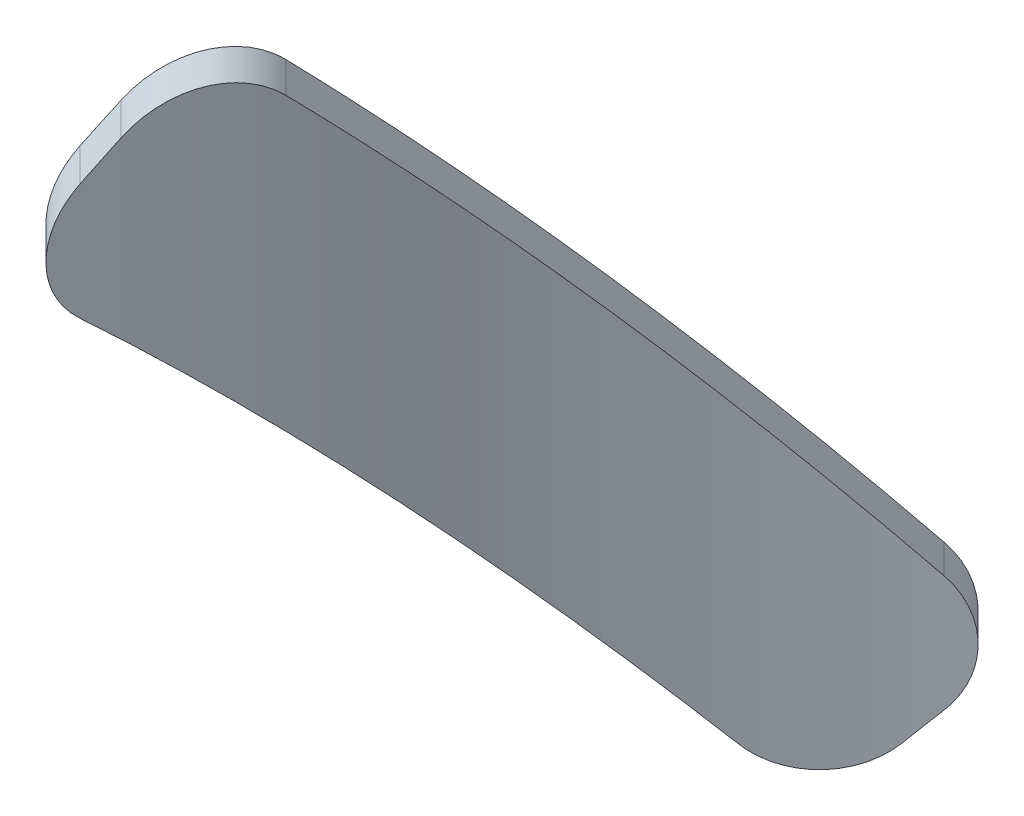
ISO-10303-21;
HEADER;
FILE_DESCRIPTION(('STEP AP214'),'2;1');
FILE_NAME('part.step','',(''),(''),'','','');
FILE_SCHEMA(('AUTOMOTIVE_DESIGN { 1 0 10303 214 1 1 1 1 }'));
ENDSEC;
DATA;
#1=APPLICATION_CONTEXT('core data for automotive mechanical design processes');
#2=APPLICATION_PROTOCOL_DEFINITION('international standard','automotive_design',2000,#1);
#3=PRODUCT_CONTEXT('',#1,'mechanical');
#4=PRODUCT('Part','Part','',(#3));
#5=PRODUCT_RELATED_PRODUCT_CATEGORY('part','',(#4));
#6=PRODUCT_DEFINITION_FORMATION('','',#4);
#7=PRODUCT_DEFINITION_CONTEXT('part definition',#1,'design');
#8=PRODUCT_DEFINITION('design','',#6,#7);
#9=PRODUCT_DEFINITION_SHAPE('','',#8);
#10=(LENGTH_UNIT() NAMED_UNIT(*) SI_UNIT(.MILLI.,.METRE.));
#11=(NAMED_UNIT(*) PLANE_ANGLE_UNIT() SI_UNIT($,.RADIAN.));
#12=(NAMED_UNIT(*) SI_UNIT($,.STERADIAN.) SOLID_ANGLE_UNIT());
#13=UNCERTAINTY_MEASURE_WITH_UNIT(LENGTH_MEASURE(1.E-05),#10,'distance_accuracy_value','');
#14=(GEOMETRIC_REPRESENTATION_CONTEXT(3) GLOBAL_UNCERTAINTY_ASSIGNED_CONTEXT((#13)) GLOBAL_UNIT_ASSIGNED_CONTEXT((#10,
#11,#12)) REPRESENTATION_CONTEXT('',''));
#15=CARTESIAN_POINT('',(0.,0.,0.));
#16=DIRECTION('',(0.,0.,1.));
#17=DIRECTION('',(1.,0.,0.));
#18=AXIS2_PLACEMENT_3D('',#15,#16,#17);
#19=CARTESIAN_POINT('',(-30.,0.,-30.));
#20=DIRECTION('',(0.,1.,0.));
#21=DIRECTION('',(0.,0.,1.));
#22=AXIS2_PLACEMENT_3D('',#19,#20,#21);
#23=CYLINDRICAL_SURFACE('',#22,28.);
#24=CARTESIAN_POINT('',(-30.,157.851563231927,-30.));
#25=DIRECTION('',(0.500000000000006,0.707106781186537,-0.50000000000001));
#26=DIRECTION('',(-0.49999999999999,0.707106781186558,0.499999999999994));
#27=AXIS2_PLACEMENT_3D('',#24,#25,#26);
#28=ELLIPSE('',#27,39.5979797464473,28.);
#29=CARTESIAN_POINT('',(-55.3750410390185,167.42462120246,-41.8366926237073));
#30=VERTEX_POINT('',#29);
#31=CARTESIAN_POINT('',(-48.5298692326011,156.110912703475,-50.9915208172896));
#32=VERTEX_POINT('',#31);
#33=EDGE_CURVE('E198',#30,#32,#28,.F.);
#34=ORIENTED_EDGE('',*,*,#33,.T.);
#35=CARTESIAN_POINT('',(-48.5298692326011,156.110912703475,-50.9915208172896));
#36=CARTESIAN_POINT('',(-48.5000069207955,156.071156552495,-51.0178811881751));
#37=CARTESIAN_POINT('',(-48.4713576898488,156.029742015388,-51.0430574230909));
#38=CARTESIAN_POINT('',(-48.4166869497929,155.943856067044,-51.0909212956081));
#39=CARTESIAN_POINT('',(-48.3906653495738,155.899384761887,-51.1136090194978));
#40=CARTESIAN_POINT('',(-48.3169162246269,155.761910814532,-51.1776964857547));
#41=CARTESIAN_POINT('',(-48.2734122760362,155.664725548558,-51.2152014707099));
#42=CARTESIAN_POINT('',(-48.1992472592149,155.462080861051,-51.278858189969));
#43=CARTESIAN_POINT('',(-48.1685932846773,155.356616907393,-51.3050036536582));
#44=CARTESIAN_POINT('',(-48.1211794442531,155.140421993944,-51.3453468171134));
#45=CARTESIAN_POINT('',(-48.1044163952034,155.029692246984,-51.3595472541429));
#46=CARTESIAN_POINT('',(-48.0853841738306,154.806368489452,-51.3756646296976));
#47=CARTESIAN_POINT('',(-48.083082687666,154.693779199245,-51.377608954096));
#48=CARTESIAN_POINT('',(-48.0929673425292,154.469672441037,-51.3692436109049));
#49=CARTESIAN_POINT('',(-48.1051562295487,154.358155180229,-51.3589316206881));
#50=CARTESIAN_POINT('',(-48.143575601618,154.139529439369,-51.3263051790284));
#51=CARTESIAN_POINT('',(-48.1697892620648,154.032415841982,-51.3040051087474));
#52=CARTESIAN_POINT('',(-48.2353576084328,153.825496036109,-51.2479076750144));
#53=CARTESIAN_POINT('',(-48.2747052320573,153.725685935532,-51.2141164902955));
#54=CARTESIAN_POINT('',(-48.3500473081551,153.567877341369,-51.1489323789086));
#55=CARTESIAN_POINT('',(-48.3827745622405,153.507045687126,-51.1205060147201));
#56=CARTESIAN_POINT('',(-48.4529191400616,153.390665908989,-51.0592482480549));
#57=CARTESIAN_POINT('',(-48.4903296272965,153.335110287003,-51.0264232617869));
#58=CARTESIAN_POINT('',(-48.5298692326011,153.282485578729,-50.9915208172896));
#59=B_SPLINE_CURVE_WITH_KNOTS('',3,(#35,#36,#37,#38,#39,#40,#41,#42,#43,#44,#45,#46,#47,#48,#49,
#50,#51,#52,#53,#54,#55,#56,#57,#58),.UNSPECIFIED.,.F.,.F.,(4,2,2,2,2,2,2,2,2,2,2,4),(0.,
0.168729734635028,0.337453616765153,0.674387818960096,1.01150777796911,1.34855046316446,
1.68483977001452,2.02119281537659,2.35714326178451,2.69291335365137,2.91657000574833,
3.13990389399824),.UNSPECIFIED.);
#60=CARTESIAN_POINT('',(-48.5298692326011,153.282485578729,-50.9915208172895));
#61=VERTEX_POINT('',#60);
#62=EDGE_CURVE('E277',#32,#61,#59,.T.);
#63=ORIENTED_EDGE('',*,*,#62,.T.);
#64=CARTESIAN_POINT('',(-30.,151.541835050277,-30.));
#65=DIRECTION('',(0.49999999999999,-0.707106781186559,-0.499999999999994));
#66=DIRECTION('',(0.500000000000006,0.707106781186536,-0.50000000000001));
#67=AXIS2_PLACEMENT_3D('',#64,#65,#66);
#68=ELLIPSE('',#67,39.597979746446,28.);
#69=CARTESIAN_POINT('',(-49.0546712613375,152.575378797542,-50.5163228460258));
#70=VERTEX_POINT('',#69);
#71=EDGE_CURVE('E335',#61,#70,#68,.F.);
#72=ORIENTED_EDGE('',*,*,#71,.T.);
#73=CARTESIAN_POINT('',(-49.0546712613375,152.575378797542,-50.5163228460258));
#74=CARTESIAN_POINT('',(-49.0838184947001,152.535627348901,-50.489252153609));
#75=CARTESIAN_POINT('',(-49.1141213045857,152.497570929926,-50.4609923628528));
#76=CARTESIAN_POINT('',(-49.1768172658032,152.425076219856,-50.4022432334779));
#77=CARTESIAN_POINT('',(-49.2092103361668,152.39063778875,-50.3717539812137));
#78=CARTESIAN_POINT('',(-49.3090924847616,152.293189360768,-50.2772608370442));
#79=CARTESIAN_POINT('',(-49.3793775323393,152.235919841276,-50.2101455069575));
#80=CARTESIAN_POINT('',(-49.5250984200888,152.138487230076,-50.0693995608617));
#81=CARTESIAN_POINT('',(-49.6005369779055,152.098333246118,-49.9957655011235));
#82=CARTESIAN_POINT('',(-49.7542513779122,152.036282536247,-49.8439211630516));
#83=CARTESIAN_POINT('',(-49.8325266114309,152.014381917594,-49.7657118642499));
#84=CARTESIAN_POINT('',(-49.9894820237552,151.98947803605,-49.606964299381));
#85=CARTESIAN_POINT('',(-50.0681614589192,151.986447659908,-49.5264295419427));
#86=CARTESIAN_POINT('',(-50.2238083149542,151.99928986518,-49.3651784441199));
#87=CARTESIAN_POINT('',(-50.3007753945302,152.015166181167,-49.284462071005));
#88=CARTESIAN_POINT('',(-50.4508580459992,152.065355059361,-49.1252290489235));
#89=CARTESIAN_POINT('',(-50.5239736883487,152.099667284182,-49.0467123597291));
#90=CARTESIAN_POINT('',(-50.664421412323,152.185747265915,-48.8942432037143));
#91=CARTESIAN_POINT('',(-50.7317566286914,152.237505485814,-48.8202882692436));
#92=CARTESIAN_POINT('',(-50.8376280916141,152.336927261314,-48.7028678295944));
#93=CARTESIAN_POINT('',(-50.8782612258911,152.380165084059,-48.6574810328362));
#94=CARTESIAN_POINT('',(-50.9557553688766,152.473075335721,-48.5703990523208));
#95=CARTESIAN_POINT('',(-50.9926216929122,152.522738467059,-48.5286986782002));
#96=CARTESIAN_POINT('',(-51.027443282416,152.575378797542,-48.4890948671042));
#97=B_SPLINE_CURVE_WITH_KNOTS('',3,(#73,#74,#75,#76,#77,#78,#79,#80,#81,#82,#83,#84,#85,#86,#87,
#88,#89,#90,#91,#92,#93,#94,#95,#96),.UNSPECIFIED.,.F.,.F.,(4,2,2,2,2,2,2,2,2,2,2,4),(0.,
0.168606603227999,0.337206679217326,0.673876716753877,1.01072568471362,1.34750279735457,
1.68379590810657,2.02015545666998,2.35650884989252,2.69267866986512,2.91635391483469,
3.13970904243861),.UNSPECIFIED.);
#98=CARTESIAN_POINT('',(-51.027443282416,152.575378797542,-48.4890948671041));
#99=VERTEX_POINT('',#98);
#100=EDGE_CURVE('E305',#70,#99,#97,.T.);
#101=ORIENTED_EDGE('',*,*,#100,.T.);
#102=CARTESIAN_POINT('',(-30.,150.780495420061,-30.));
#103=DIRECTION('',(-0.500000000000015,-0.707106781186523,0.500000000000019));
#104=DIRECTION('',(-0.499999999999981,0.707106781186572,0.499999999999985));
#105=AXIS2_PLACEMENT_3D('',#102,#103,#104);
#106=ELLIPSE('',#105,39.597979746448,28.);
#107=CARTESIAN_POINT('',(-56.7643852526283,163.889087296527,-38.2260368373169));
#108=VERTEX_POINT('',#107);
#109=EDGE_CURVE('E304',#99,#108,#106,.F.);
#110=ORIENTED_EDGE('',*,*,#109,.T.);
#111=CARTESIAN_POINT('',(-56.7643852526283,163.889087296527,-38.2260368373169));
#112=CARTESIAN_POINT('',(-56.776641215634,163.925953268659,-38.1861615850808));
#113=CARTESIAN_POINT('',(-56.788390596239,163.964399178829,-38.1476151035475));
#114=CARTESIAN_POINT('',(-56.8108306041014,164.044358269233,-38.0734664484447));
#115=CARTESIAN_POINT('',(-56.8215206492122,164.085873114328,-38.0378658955319));
#116=CARTESIAN_POINT('',(-56.851976938465,164.215085817851,-37.935766268294));
#117=CARTESIAN_POINT('',(-56.8700524958863,164.307221361908,-37.8742209469578));
#118=CARTESIAN_POINT('',(-56.9012216878482,164.501558608482,-37.7670728894173));
#119=CARTESIAN_POINT('',(-56.9142975214104,164.603794677194,-37.7215271639633));
#120=CARTESIAN_POINT('',(-56.9349232764219,164.815088065883,-37.6492704529723));
#121=CARTESIAN_POINT('',(-56.9424847853383,164.924130556403,-37.6225199765903));
#122=CARTESIAN_POINT('',(-56.9514581277469,165.136872699362,-37.5907281762104));
#123=CARTESIAN_POINT('',(-56.953303069718,165.240326996355,-37.5841582710898));
#124=CARTESIAN_POINT('',(-56.9520105108362,165.446804135519,-37.5887507396826));
#125=CARTESIAN_POINT('',(-56.9488737500457,165.549827039497,-37.5999104795487));
#126=CARTESIAN_POINT('',(-56.937998704469,165.74740963295,-37.6383630322157));
#127=CARTESIAN_POINT('',(-56.9304869211357,165.842138646437,-37.6648613559587));
#128=CARTESIAN_POINT('',(-56.9112683830522,166.026044069808,-37.7320664508494));
#129=CARTESIAN_POINT('',(-56.8995562695208,166.115213215039,-37.7727913705591));
#130=CARTESIAN_POINT('',(-56.8703313331978,166.297880085867,-37.8732697288594));
#131=CARTESIAN_POINT('',(-56.8522405965173,166.390273367769,-37.9348749371042));
#132=CARTESIAN_POINT('',(-56.8217283281516,166.519908514088,-38.0371733516411));
#133=CARTESIAN_POINT('',(-56.8110019794864,166.561606463275,-38.0728979919169));
#134=CARTESIAN_POINT('',(-56.788481970071,166.641902913396,-38.1473153340714));
#135=CARTESIAN_POINT('',(-56.7766890274501,166.680503467219,-38.1860060362886));
#136=CARTESIAN_POINT('',(-56.7643852526282,166.717514421273,-38.226036837317));
#137=B_SPLINE_CURVE_WITH_KNOTS('',3,(#111,#112,#113,#114,#115,#116,#117,#118,#119,#120,#121,
#122,#123,#124,#125,#126,#127,#128,#129,#130,#131,#132,#133,#134,#135,#136),.UNSPECIFIED.,.F.,
.F.,(4,2,2,2,2,2,2,2,2,2,2,2,4),(0.,0.16693473233809,0.333960698987016,0.669050148588139,
1.00532177880261,1.34088473595609,1.65031171917411,1.95969273941767,2.25432438345938,
2.5493332636037,2.88510642600991,3.05280120639973,3.22038390801111),.UNSPECIFIED.);
#138=CARTESIAN_POINT('',(-56.7643852526282,166.717514421273,-38.226036837317));
#139=VERTEX_POINT('',#138);
#140=EDGE_CURVE('E301',#108,#139,#137,.T.);
#141=ORIENTED_EDGE('',*,*,#140,.T.);
#142=CARTESIAN_POINT('',(-30.,179.826106297738,-30.));
#143=DIRECTION('',(-0.499999999999988,0.707106781186562,0.499999999999992));
#144=DIRECTION('',(0.500000000000009,0.707106781186533,-0.500000000000012));
#145=AXIS2_PLACEMENT_3D('',#142,#143,#144);
#146=ELLIPSE('',#145,39.5979797464458,28.);
#147=CARTESIAN_POINT('',(-56.5202751232548,167.42462120246,-38.9819267079437));
#148=VERTEX_POINT('',#147);
#149=EDGE_CURVE('E211',#139,#148,#146,.F.);
#150=ORIENTED_EDGE('',*,*,#149,.T.);
#151=CARTESIAN_POINT('',(-56.5202751232548,167.42462120246,-38.9819267079437));
#152=CARTESIAN_POINT('',(-56.4895196309032,167.510669527077,-39.0728050858537));
#153=CARTESIAN_POINT('',(-56.455828480866,167.587977499844,-39.1706835560118));
#154=CARTESIAN_POINT('',(-56.3834880922561,167.723921400822,-39.3767320471662));
#155=CARTESIAN_POINT('',(-56.3448488852947,167.78259429419,-39.4848811340951));
#156=CARTESIAN_POINT('',(-56.263449485485,167.880364450654,-39.7080066716459));
#157=CARTESIAN_POINT('',(-56.2206947613322,167.919487275055,-39.8229739862667));
#158=CARTESIAN_POINT('',(-56.1319266573786,167.977575941348,-40.0567400601932));
#159=CARTESIAN_POINT('',(-56.0859117846212,167.996532483794,-40.1755405611334));
#160=CARTESIAN_POINT('',(-55.9898647052689,168.014017526186,-40.4184762288237));
#161=CARTESIAN_POINT('',(-55.9397457395959,168.011716763197,-40.5426380780232));
#162=CARTESIAN_POINT('',(-55.8386108233751,167.984285241973,-40.7881329261961));
#163=CARTESIAN_POINT('',(-55.7875945850669,167.959147023711,-40.9094649875137));
#164=CARTESIAN_POINT('',(-55.6874427244509,167.886794592816,-41.1432114770296));
#165=CARTESIAN_POINT('',(-55.6382898008684,167.840013484587,-41.2557523919334));
#166=CARTESIAN_POINT('',(-55.542882644111,167.725213292254,-41.4706108761247));
#167=CARTESIAN_POINT('',(-55.4966218577129,167.657244478292,-41.5729518950946));
#168=CARTESIAN_POINT('',(-55.4394094092697,167.55554620755,-41.6977569438735));
#169=CARTESIAN_POINT('',(-55.4261424709155,167.530600080744,-41.726561517957));
#170=CARTESIAN_POINT('',(-55.4001661463789,167.478933818415,-41.7827207418522));
#171=CARTESIAN_POINT('',(-55.3874560556898,167.452216038681,-41.8100772334325));
#172=CARTESIAN_POINT('',(-55.3750410390185,167.42462120246,-41.8366926237074));
#173=B_SPLINE_CURVE_WITH_KNOTS('',3,(#151,#152,#153,#154,#155,#156,#157,#158,#159,#160,#161,
#162,#163,#164,#165,#166,#167,#168,#169,#170,#171,#172),.UNSPECIFIED.,.F.,.F.,(4,2,2,2,2,2,2,2,
2,2,4),(0.,0.385838680752368,0.770907148672841,1.15547082166198,1.54021175492939,
1.9400231959306,2.33996528531806,2.73222886218637,3.12356874500616,3.24456549783948,
3.36540446675177),.UNSPECIFIED.);
#174=EDGE_CURVE('E204',#148,#30,#173,.T.);
#175=ORIENTED_EDGE('',*,*,#174,.T.);
#176=EDGE_LOOP('',(#34,#63,#72,#101,#110,#141,#150,#175));
#177=FACE_BOUND('',#176,.T.);
#178=ADVANCED_FACE('F116',(#177),#23,.T.);
#179=CARTESIAN_POINT('',(61.3719205041654,156.110912703475,58.910268919476));
#180=DIRECTION('',(0.500000000000006,0.707106781186537,-0.50000000000001));
#181=DIRECTION('',(0.,0.577350269189639,0.816496580927717));
#182=AXIS2_PLACEMENT_3D('',#179,#180,#181);
#183=PLANE('',#182);
#184=DIRECTION('',(-0.70710678118655,0.,-0.707106781186545));
#185=VECTOR('',#184,1.);
#186=CARTESIAN_POINT('',(53.3719205041655,167.42462120246,66.9102689194759));
#187=LINE('',#186,#185);
#188=CARTESIAN_POINT('',(-54.6207366195682,167.42462120246,-41.082388204257));
#189=VERTEX_POINT('',#188);
#190=EDGE_CURVE('E183',#189,#30,#187,.T.);
#191=ORIENTED_EDGE('',*,*,#190,.F.);
#192=CARTESIAN_POINT('',(-30.,157.851563231927,-30.));
#193=DIRECTION('',(0.500000000000006,0.707106781186537,-0.500000000000009));
#194=DIRECTION('',(0.499999999999991,-0.707106781186558,-0.499999999999994));
#195=AXIS2_PLACEMENT_3D('',#192,#193,#194);
#196=ELLIPSE('',#195,38.1837661840741,27.);
#197=CARTESIAN_POINT('',(-47.8213412200693,156.110912703475,-50.2829928047579));
#198=VERTEX_POINT('',#197);
#199=EDGE_CURVE('E195',#189,#198,#196,.F.);
#200=ORIENTED_EDGE('',*,*,#199,.T.);
#201=DIRECTION('',(-0.70710678118655,0.,-0.707106781186545));
#202=VECTOR('',#201,1.);
#203=CARTESIAN_POINT('',(61.3719205041654,156.110912703475,58.910268919476));
#204=LINE('',#203,#202);
#205=EDGE_CURVE('E135',#198,#32,#204,.T.);
#206=ORIENTED_EDGE('',*,*,#205,.T.);
#207=ORIENTED_EDGE('',*,*,#33,.F.);
#208=EDGE_LOOP('',(#191,#200,#206,#207));
#209=FACE_BOUND('',#208,.T.);
#210=ADVANCED_FACE('F194',(#209),#183,.T.);
#211=CARTESIAN_POINT('',(52.3719205041655,166.010407640087,67.9102689194759));
#212=DIRECTION('',(-0.70710678118655,0.,-0.707106781186545));
#213=DIRECTION('',(-0.707106781186545,0.,0.70710678118655));
#214=AXIS2_PLACEMENT_3D('',#211,#212,#213);
#215=CYLINDRICAL_SURFACE('',#214,2.);
#216=DIRECTION('',(-0.70710678118655,0.,-0.707106781186545));
#217=VECTOR('',#216,1.);
#218=CARTESIAN_POINT('',(51.3719205041656,167.42462120246,68.9102689194759));
#219=LINE('',#218,#217);
#220=CARTESIAN_POINT('',(-55.7279944412623,167.42462120246,-38.1896460259512));
#221=VERTEX_POINT('',#220);
#222=EDGE_CURVE('E186',#221,#148,#219,.T.);
#223=ORIENTED_EDGE('',*,*,#222,.F.);
#224=CARTESIAN_POINT('',(-55.7279944412623,167.42462120246,-38.1896460259511));
#225=CARTESIAN_POINT('',(-55.6984492746334,167.511228553405,-38.2825419883532));
#226=CARTESIAN_POINT('',(-55.6660435617716,167.588927553392,-38.3825341047532));
#227=CARTESIAN_POINT('',(-55.5963652477756,167.725376133633,-38.5929024022669));
#228=CARTESIAN_POINT('',(-55.55910277874,167.784164303692,-38.7032568352588));
#229=CARTESIAN_POINT('',(-55.4804941444775,167.881951669353,-38.9307882388099));
#230=CARTESIAN_POINT('',(-55.4391539525892,167.920979311959,-39.0479551295926));
#231=CARTESIAN_POINT('',(-55.3531923112489,167.97870152027,-39.2860995499108));
#232=CARTESIAN_POINT('',(-55.3085692268103,167.997385880171,-39.4070789608236));
#233=CARTESIAN_POINT('',(-55.2151468340098,168.01414955991,-39.6547715444445));
#234=CARTESIAN_POINT('',(-55.1662507295243,168.011324654124,-39.7815109500401));
#235=CARTESIAN_POINT('',(-55.0674451668283,167.982460101231,-40.0320146470994));
#236=CARTESIAN_POINT('',(-55.0175353691274,167.956412547165,-40.1557779104909));
#237=CARTESIAN_POINT('',(-54.9195984977548,167.881929509134,-40.3937395610272));
#238=CARTESIAN_POINT('',(-54.8715541366674,167.833997354641,-40.5080881561041));
#239=CARTESIAN_POINT('',(-54.7782708787726,167.716566003224,-40.7261972380704));
#240=CARTESIAN_POINT('',(-54.7330251894283,167.647121696788,-40.8299837896876));
#241=CARTESIAN_POINT('',(-54.6782831204332,167.545474564692,-40.9536862176929));
#242=CARTESIAN_POINT('',(-54.6664530278532,167.52235191469,-40.9802965934056));
#243=CARTESIAN_POINT('',(-54.6432481958143,167.474607011418,-41.0322762970927));
#244=CARTESIAN_POINT('',(-54.6318729031839,167.4499866778,-41.0576471415974));
#245=CARTESIAN_POINT('',(-54.6207366195682,167.42462120246,-41.0823882042571));
#246=B_SPLINE_CURVE_WITH_KNOTS('',3,(#224,#225,#226,#227,#228,#229,#230,#231,#232,#233,#234,
#235,#236,#237,#238,#239,#240,#241,#242,#243,#244,#245),.UNSPECIFIED.,.F.,.F.,(4,2,2,2,2,2,2,2,
2,2,4),(0.,0.390371470394837,0.779941212012322,1.16894852794345,1.55815091099496,
1.96380253221803,2.36959232442185,2.76648598764705,3.16237516302809,3.27389333311929,
3.38527145983039),.UNSPECIFIED.);
#247=EDGE_CURVE('E180',#221,#189,#246,.T.);
#248=ORIENTED_EDGE('',*,*,#247,.T.);
#249=ORIENTED_EDGE('',*,*,#190,.T.);
#250=ORIENTED_EDGE('',*,*,#174,.F.);
#251=EDGE_LOOP('',(#223,#248,#249,#250));
#252=FACE_BOUND('',#251,.T.);
#253=ADVANCED_FACE('F182',(#252),#215,.T.);
#254=CARTESIAN_POINT('',(51.3719205041656,167.42462120246,68.9102689194759));
#255=DIRECTION('',(-0.499999999999988,0.707106781186562,0.499999999999992));
#256=DIRECTION('',(0.,-0.577350269189611,0.816496580927736));
#257=AXIS2_PLACEMENT_3D('',#254,#255,#256);
#258=PLANE('',#257);
#259=DIRECTION('',(-0.70710678118655,0.,-0.707106781186545));
#260=VECTOR('',#259,1.);
#261=CARTESIAN_POINT('',(50.8719205041655,166.717514421273,69.4102689194759));
#262=LINE('',#261,#260);
#263=CARTESIAN_POINT('',(-55.9599623708351,166.717514421273,-37.4216139555239));
#264=VERTEX_POINT('',#263);
#265=EDGE_CURVE('E252',#264,#139,#262,.T.);
#266=ORIENTED_EDGE('',*,*,#265,.F.);
#267=CARTESIAN_POINT('',(-30.,179.826106297738,-30.));
#268=DIRECTION('',(-0.499999999999988,0.707106781186562,0.499999999999991));
#269=DIRECTION('',(-0.500000000000009,-0.707106781186533,0.500000000000012));
#270=AXIS2_PLACEMENT_3D('',#267,#268,#269);
#271=ELLIPSE('',#270,38.1837661840728,27.);
#272=EDGE_CURVE('E200',#264,#221,#271,.F.);
#273=ORIENTED_EDGE('',*,*,#272,.T.);
#274=ORIENTED_EDGE('',*,*,#222,.T.);
#275=ORIENTED_EDGE('',*,*,#149,.F.);
#276=EDGE_LOOP('',(#266,#273,#274,#275));
#277=FACE_BOUND('',#276,.T.);
#278=ADVANCED_FACE('F288',(#277),#258,.T.);
#279=CARTESIAN_POINT('',(51.8719205041655,165.3033008589,68.410268919476));
#280=DIRECTION('',(-0.70710678118655,0.,-0.707106781186545));
#281=DIRECTION('',(-0.707106781186545,0.,0.70710678118655));
#282=AXIS2_PLACEMENT_3D('',#279,#280,#281);
#283=CYLINDRICAL_SURFACE('',#282,2.);
#284=DIRECTION('',(-0.70710678118655,0.,-0.707106781186545));
#285=VECTOR('',#284,1.);
#286=CARTESIAN_POINT('',(50.8719205041655,163.889087296527,69.410268919476));
#287=LINE('',#286,#285);
#288=CARTESIAN_POINT('',(-55.9599623708351,163.889087296527,-37.4216139555237));
#289=VERTEX_POINT('',#288);
#290=EDGE_CURVE('E266',#289,#108,#287,.T.);
#291=ORIENTED_EDGE('',*,*,#290,.F.);
#292=CARTESIAN_POINT('',(-55.9599623708351,163.889087296527,-37.4216139555238));
#293=CARTESIAN_POINT('',(-55.9714865050014,163.925742789783,-37.3813050005978));
#294=CARTESIAN_POINT('',(-55.9825317735186,163.963972436438,-37.3423132958645));
#295=CARTESIAN_POINT('',(-56.0036250305309,164.043500968112,-37.2672555117207));
#296=CARTESIAN_POINT('',(-56.0136724225984,164.084801663208,-37.2311911843187));
#297=CARTESIAN_POINT('',(-56.0423102359753,164.213444868965,-37.1276374442123));
#298=CARTESIAN_POINT('',(-56.059308882634,164.305251317717,-37.0650953138332));
#299=CARTESIAN_POINT('',(-56.0886366129599,164.499102943426,-36.9560237866798));
#300=CARTESIAN_POINT('',(-56.1009477265869,164.601185662577,-36.9095560735096));
#301=CARTESIAN_POINT('',(-56.1203822850953,164.81231639576,-36.8357228143224));
#302=CARTESIAN_POINT('',(-56.1275184111042,164.921346666194,-36.8083105803959));
#303=CARTESIAN_POINT('',(-56.1359874159757,165.133403313545,-36.7757227403663));
#304=CARTESIAN_POINT('',(-56.1377613857561,165.23615398591,-36.7688574736031));
#305=CARTESIAN_POINT('',(-56.1367029870231,165.4413089041,-36.7729435389932));
#306=CARTESIAN_POINT('',(-56.1338697231399,165.543713078709,-36.7838983342982));
#307=CARTESIAN_POINT('',(-56.1239662756646,165.739634452364,-36.8219305463951));
#308=CARTESIAN_POINT('',(-56.1171259561483,165.833336123123,-36.848132791855));
#309=CARTESIAN_POINT('',(-56.0996006580609,166.015225773209,-36.9146235342953));
#310=CARTESIAN_POINT('',(-56.0889140858642,166.103411449278,-36.9549178698835));
#311=CARTESIAN_POINT('',(-56.0633123287205,166.27684248811,-37.0502699422006));
#312=CARTESIAN_POINT('',(-56.0482053083382,166.361693211456,-37.1059892824594));
#313=CARTESIAN_POINT('',(-56.0143819145416,166.521696502438,-37.2288288793289));
#314=CARTESIAN_POINT('',(-55.9956702830166,166.596861597133,-37.2959341440044));
#315=CARTESIAN_POINT('',(-55.9703107732608,166.683966103339,-37.3853438392426));
#316=CARTESIAN_POINT('',(-55.965184675209,166.700907190272,-37.4033475433481));
#317=CARTESIAN_POINT('',(-55.9599623708351,166.717514421273,-37.4216139555239));
#318=B_SPLINE_CURVE_WITH_KNOTS('',3,(#292,#293,#294,#295,#296,#297,#298,#299,#300,#301,#302,
#303,#304,#305,#306,#307,#308,#309,#310,#311,#312,#313,#314,#315,#316,#317),.UNSPECIFIED.,.F.,
.F.,(4,2,2,2,2,2,2,2,2,2,2,2,4),(0.,0.166987372657459,0.334073959944567,0.669503260786987,
1.00620581177262,1.34208047084725,1.64945162325077,1.95688251731393,2.24819928463119,
2.53963689302193,2.84630824457722,3.15257888942203,3.22830143981506),.UNSPECIFIED.);
#319=EDGE_CURVE('E245',#289,#264,#318,.T.);
#320=ORIENTED_EDGE('',*,*,#319,.T.);
#321=ORIENTED_EDGE('',*,*,#265,.T.);
#322=ORIENTED_EDGE('',*,*,#140,.F.);
#323=EDGE_LOOP('',(#291,#320,#321,#322));
#324=FACE_BOUND('',#323,.T.);
#325=ADVANCED_FACE('F312',(#324),#283,.T.);
#326=CARTESIAN_POINT('',(50.8719205041655,163.889087296527,69.410268919476));
#327=DIRECTION('',(-0.500000000000015,-0.707106781186523,0.500000000000019));
#328=DIRECTION('',(0.,-0.577350269189653,-0.816496580927706));
#329=AXIS2_PLACEMENT_3D('',#326,#327,#328);
#330=PLANE('',#329);
#331=DIRECTION('',(-0.70710678118655,0.,-0.707106781186545));
#332=VECTOR('',#331,1.);
#333=CARTESIAN_POINT('',(58.8719205041652,152.575378797542,61.4102689194762));
#334=LINE('',#333,#332);
#335=CARTESIAN_POINT('',(-50.3188250399054,152.575378797542,-47.7804766245935));
#336=VERTEX_POINT('',#335);
#337=EDGE_CURVE('E270',#336,#99,#334,.T.);
#338=ORIENTED_EDGE('',*,*,#337,.F.);
#339=CARTESIAN_POINT('',(-30.,150.780495420061,-30.));
#340=DIRECTION('',(-0.500000000000015,-0.707106781186523,0.500000000000019));
#341=DIRECTION('',(0.499999999999981,-0.707106781186572,-0.499999999999985));
#342=AXIS2_PLACEMENT_3D('',#339,#340,#341);
#343=ELLIPSE('',#342,38.1837661840749,27.);
#344=EDGE_CURVE('E253',#336,#289,#343,.F.);
#345=ORIENTED_EDGE('',*,*,#344,.T.);
#346=ORIENTED_EDGE('',*,*,#290,.T.);
#347=ORIENTED_EDGE('',*,*,#109,.F.);
#348=EDGE_LOOP('',(#338,#345,#346,#347));
#349=FACE_BOUND('',#348,.T.);
#350=ADVANCED_FACE('F316',(#349),#330,.T.);
#351=CARTESIAN_POINT('',(59.8719205041652,153.989592359915,60.4102689194762));
#352=DIRECTION('',(-0.70710678118655,0.,-0.707106781186545));
#353=DIRECTION('',(-0.707106781186545,0.,0.70710678118655));
#354=AXIS2_PLACEMENT_3D('',#351,#352,#353);
#355=CYLINDRICAL_SURFACE('',#354,2.00000000000002);
#356=DIRECTION('',(-0.70710678118655,0.,-0.707106781186545));
#357=VECTOR('',#356,1.);
#358=CARTESIAN_POINT('',(60.8719205041653,152.575378797542,59.4102689194761));
#359=LINE('',#358,#357);
#360=CARTESIAN_POINT('',(-48.3470643861123,152.575378797542,-49.8087159708006));
#361=VERTEX_POINT('',#360);
#362=EDGE_CURVE('E226',#361,#70,#359,.T.);
#363=ORIENTED_EDGE('',*,*,#362,.F.);
#364=CARTESIAN_POINT('',(-48.3470643861123,152.575378797542,-49.8087159708006));
#365=CARTESIAN_POINT('',(-48.3762480954624,152.535630126549,-49.7816856720845));
#366=CARTESIAN_POINT('',(-48.4065866133331,152.497576204871,-49.7534657932986));
#367=CARTESIAN_POINT('',(-48.4693512602264,152.425085844066,-49.6947940662682));
#368=CARTESIAN_POINT('',(-48.5017773098415,152.390649267469,-49.6643423029162));
#369=CARTESIAN_POINT('',(-48.6017527414394,152.29320501046,-49.5699553908219));
#370=CARTESIAN_POINT('',(-48.6720922166904,152.23593689004,-49.502903022182));
#371=CARTESIAN_POINT('',(-48.817897543021,152.13850459811,-49.3622570549399));
#372=CARTESIAN_POINT('',(-48.8933661181672,152.098349599002,-49.2886599739373));
#373=CARTESIAN_POINT('',(-49.0471087390694,152.036295425156,-49.1368571681698));
#374=CARTESIAN_POINT('',(-49.1253821749996,152.014392306958,-49.0586524428339));
#375=CARTESIAN_POINT('',(-49.2822899278081,151.989483422732,-48.899887092746));
#376=CARTESIAN_POINT('',(-49.3609235006746,151.986448524761,-48.8193302928548));
#377=CARTESIAN_POINT('',(-49.5164435654984,151.999275812078,-48.6580005886574));
#378=CARTESIAN_POINT('',(-49.5933297089875,152.015141733404,-48.5772276447765));
#379=CARTESIAN_POINT('',(-49.7432191886519,152.065302752817,-48.4178520391876));
#380=CARTESIAN_POINT('',(-49.8162226597957,152.099597209834,-48.3392493020853));
#381=CARTESIAN_POINT('',(-49.956425649634,152.185634069181,-48.1865832892523));
#382=CARTESIAN_POINT('',(-50.0236282965781,152.237366992575,-48.1125175731484));
#383=CARTESIAN_POINT('',(-50.1293121171224,152.33677844675,-47.9948551097091));
#384=CARTESIAN_POINT('',(-50.1698891840821,152.380039611183,-47.9493444607288));
#385=CARTESIAN_POINT('',(-50.2472645117728,152.473005856407,-47.8620180826228));
#386=CARTESIAN_POINT('',(-50.2840681005551,152.522701620781,-47.8201971556882));
#387=CARTESIAN_POINT('',(-50.3188250399053,152.575378797542,-47.7804766245935));
#388=B_SPLINE_CURVE_WITH_KNOTS('',3,(#364,#365,#366,#367,#368,#369,#370,#371,#372,#373,#374,
#375,#376,#377,#378,#379,#380,#381,#382,#383,#384,#385,#386,#387),.UNSPECIFIED.,.F.,.F.,(4,2,2,
2,2,2,2,2,2,2,2,4),(0.,0.168599199742781,0.337191989930754,0.67384943434324,1.0106870963615,
1.34745196309982,1.68369674599817,2.02000800388289,2.35630756333727,2.69242461619955,
2.91627399531687,3.13980282156044),.UNSPECIFIED.);
#389=EDGE_CURVE('E237',#361,#336,#388,.T.);
#390=ORIENTED_EDGE('',*,*,#389,.T.);
#391=ORIENTED_EDGE('',*,*,#337,.T.);
#392=ORIENTED_EDGE('',*,*,#100,.F.);
#393=EDGE_LOOP('',(#363,#390,#391,#392));
#394=FACE_BOUND('',#393,.T.);
#395=ADVANCED_FACE('F320',(#394),#355,.T.);
#396=CARTESIAN_POINT('',(60.8719205041652,152.575378797542,59.4102689194761));
#397=DIRECTION('',(0.49999999999999,-0.707106781186559,-0.499999999999994));
#398=DIRECTION('',(0.,0.577350269189615,-0.816496580927734));
#399=AXIS2_PLACEMENT_3D('',#396,#397,#398);
#400=PLANE('',#399);
#401=DIRECTION('',(-0.70710678118655,0.,-0.707106781186545));
#402=VECTOR('',#401,1.);
#403=CARTESIAN_POINT('',(61.3719205041653,153.282485578729,58.9102689194761));
#404=LINE('',#403,#402);
#405=CARTESIAN_POINT('',(-47.8213412200694,153.282485578729,-50.2829928047578));
#406=VERTEX_POINT('',#405);
#407=EDGE_CURVE('E13',#406,#61,#404,.T.);
#408=ORIENTED_EDGE('',*,*,#407,.F.);
#409=CARTESIAN_POINT('',(-30.,151.541835050277,-30.));
#410=DIRECTION('',(0.49999999999999,-0.707106781186559,-0.499999999999994));
#411=DIRECTION('',(-0.500000000000006,-0.707106781186536,0.50000000000001));
#412=AXIS2_PLACEMENT_3D('',#409,#410,#411);
#413=ELLIPSE('',#412,38.1837661840729,27.);
#414=EDGE_CURVE('E120',#406,#361,#413,.F.);
#415=ORIENTED_EDGE('',*,*,#414,.T.);
#416=ORIENTED_EDGE('',*,*,#362,.T.);
#417=ORIENTED_EDGE('',*,*,#71,.F.);
#418=EDGE_LOOP('',(#408,#415,#416,#417));
#419=FACE_BOUND('',#418,.T.);
#420=ADVANCED_FACE('F325',(#419),#400,.T.);
#421=CARTESIAN_POINT('',(60.3719205041653,154.696699141102,59.910268919476));
#422=DIRECTION('',(-0.70710678118655,0.,-0.707106781186545));
#423=DIRECTION('',(-0.707106781186545,0.,0.70710678118655));
#424=AXIS2_PLACEMENT_3D('',#421,#422,#423);
#425=CYLINDRICAL_SURFACE('',#424,2.00000000000001);
#426=ORIENTED_EDGE('',*,*,#205,.F.);
#427=CARTESIAN_POINT('',(-47.8213412200693,156.110912703475,-50.2829928047578));
#428=CARTESIAN_POINT('',(-47.7914156472571,156.071159003253,-50.3092864293686));
#429=CARTESIAN_POINT('',(-47.7627034760283,156.029747085483,-50.3343966260672));
#430=CARTESIAN_POINT('',(-47.7079089146424,155.943866424299,-50.3821314262456));
#431=CARTESIAN_POINT('',(-47.681826435934,155.899397783901,-50.4047561134239));
#432=CARTESIAN_POINT('',(-47.6078996774119,155.761930695534,-50.468661868692));
#433=CARTESIAN_POINT('',(-47.5642843614305,155.664749277402,-50.5060548523274));
#434=CARTESIAN_POINT('',(-47.4899225441254,155.462109306072,-50.5695166986854));
#435=CARTESIAN_POINT('',(-47.4591832200591,155.35664617532,-50.5955792459707));
#436=CARTESIAN_POINT('',(-47.4116347418246,155.140450586998,-50.6357929682326));
#437=CARTESIAN_POINT('',(-47.3948223399447,155.029719364303,-50.6499469202661));
#438=CARTESIAN_POINT('',(-47.375734805559,154.806410084287,-50.6660107204967));
#439=CARTESIAN_POINT('',(-47.3734248278662,154.693837105833,-50.6679499173023));
#440=CARTESIAN_POINT('',(-47.3833300006467,154.46976258312,-50.6596194981821));
#441=CARTESIAN_POINT('',(-47.395547897664,154.358261245476,-50.6493475737027));
#442=CARTESIAN_POINT('',(-47.4340567259237,154.139678501954,-50.6168449061207));
#443=CARTESIAN_POINT('',(-47.4603293015932,154.032591526896,-50.5946297608151));
#444=CARTESIAN_POINT('',(-47.5260384850033,153.825721134891,-50.5387395312783));
#445=CARTESIAN_POINT('',(-47.5654680676706,153.725933854926,-50.5050705625333));
#446=CARTESIAN_POINT('',(-47.6409887274734,153.568093025921,-50.4400855138212));
#447=CARTESIAN_POINT('',(-47.6738141964028,153.507212877625,-50.4117238388591));
#448=CARTESIAN_POINT('',(-47.7441671200268,153.390743630833,-50.3505945405873));
#449=CARTESIAN_POINT('',(-47.7816877124771,153.335147014599,-50.3178333424704));
#450=CARTESIAN_POINT('',(-47.8213412200693,153.282485578729,-50.2829928047578));
#451=B_SPLINE_CURVE_WITH_KNOTS('',3,(#427,#428,#429,#430,#431,#432,#433,#434,#435,#436,#437,
#438,#439,#440,#441,#442,#443,#444,#445,#446,#447,#448,#449,#450),.UNSPECIFIED.,.F.,.F.,(4,2,2,
2,2,2,2,2,2,2,2,4),(0.,0.168731704665598,0.337457725620666,0.674399466745378,1.01152877475799,
1.34857944319153,1.68481996412898,2.02112406258028,2.35699001244539,2.69267691570448,
2.91650653789092,3.14001275732332),.UNSPECIFIED.);
#452=EDGE_CURVE('E127',#198,#406,#451,.T.);
#453=ORIENTED_EDGE('',*,*,#452,.T.);
#454=ORIENTED_EDGE('',*,*,#407,.T.);
#455=ORIENTED_EDGE('',*,*,#62,.F.);
#456=EDGE_LOOP('',(#426,#453,#454,#455));
#457=FACE_BOUND('',#456,.T.);
#458=ADVANCED_FACE('F343',(#457),#425,.T.);
#459=CARTESIAN_POINT('',(-30.,0.,-30.));
#460=DIRECTION('',(0.,1.,0.));
#461=DIRECTION('',(0.,0.,1.));
#462=AXIS2_PLACEMENT_3D('',#459,#460,#461);
#463=CYLINDRICAL_SURFACE('',#462,27.);
#464=ORIENTED_EDGE('',*,*,#452,.F.);
#465=ORIENTED_EDGE('',*,*,#199,.F.);
#466=ORIENTED_EDGE('',*,*,#247,.F.);
#467=ORIENTED_EDGE('',*,*,#272,.F.);
#468=ORIENTED_EDGE('',*,*,#319,.F.);
#469=ORIENTED_EDGE('',*,*,#344,.F.);
#470=ORIENTED_EDGE('',*,*,#389,.F.);
#471=ORIENTED_EDGE('',*,*,#414,.F.);
#472=EDGE_LOOP('',(#464,#465,#466,#467,#468,#469,#470,#471));
#473=FACE_BOUND('',#472,.T.);
#474=ADVANCED_FACE('F118',(#473),#463,.F.);
#475=CLOSED_SHELL('',(#178,#210,#253,#278,#325,#350,#395,#420,#458,#474));
#476=MANIFOLD_SOLID_BREP('B2',#475);
#477=ADVANCED_BREP_SHAPE_REPRESENTATION('',(#18,#476),#14);
#478=SHAPE_DEFINITION_REPRESENTATION(#9,#477);
ENDSEC;
END-ISO-10303-21;
